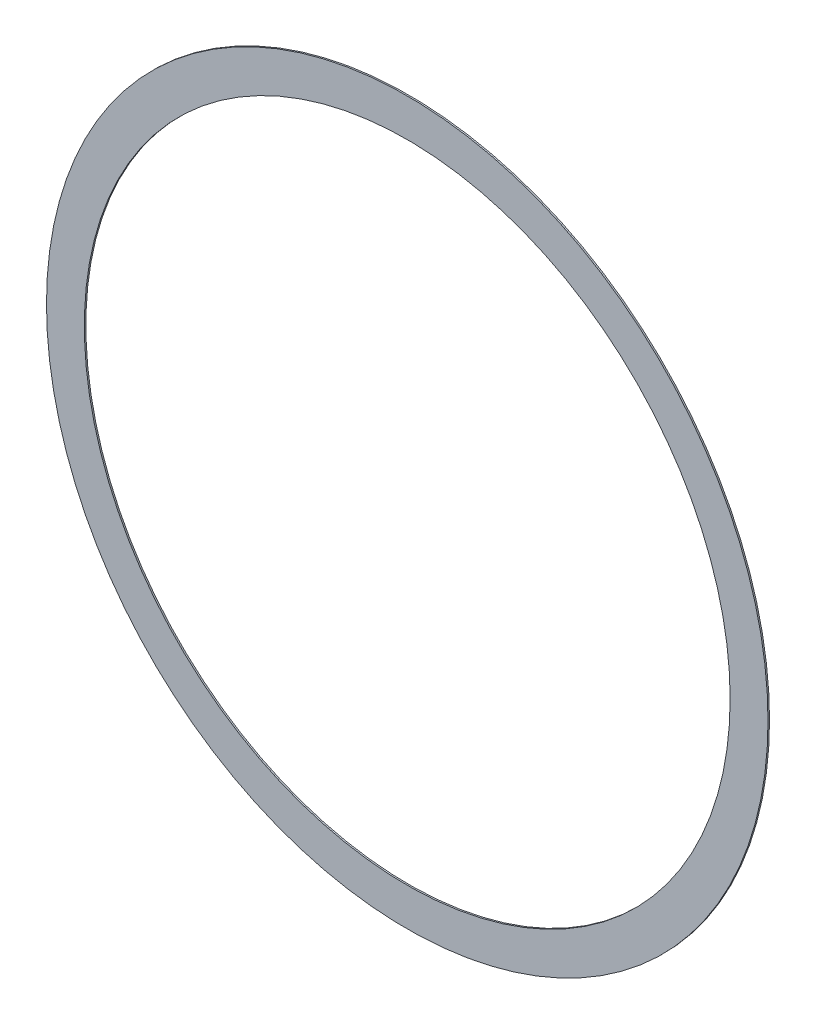
ISO-10303-21;
HEADER;
FILE_DESCRIPTION(('STEP AP214'),'2;1');
FILE_NAME('part.step','',(''),(''),'','','');
FILE_SCHEMA(('AUTOMOTIVE_DESIGN { 1 0 10303 214 1 1 1 1 }'));
ENDSEC;
DATA;
#1=APPLICATION_CONTEXT('core data for automotive mechanical design processes');
#2=APPLICATION_PROTOCOL_DEFINITION('international standard','automotive_design',2000,#1);
#3=PRODUCT_CONTEXT('',#1,'mechanical');
#4=PRODUCT('Part','Part','',(#3));
#5=PRODUCT_RELATED_PRODUCT_CATEGORY('part','',(#4));
#6=PRODUCT_DEFINITION_FORMATION('','',#4);
#7=PRODUCT_DEFINITION_CONTEXT('part definition',#1,'design');
#8=PRODUCT_DEFINITION('design','',#6,#7);
#9=PRODUCT_DEFINITION_SHAPE('','',#8);
#10=(LENGTH_UNIT() NAMED_UNIT(*) SI_UNIT(.MILLI.,.METRE.));
#11=(NAMED_UNIT(*) PLANE_ANGLE_UNIT() SI_UNIT($,.RADIAN.));
#12=(NAMED_UNIT(*) SI_UNIT($,.STERADIAN.) SOLID_ANGLE_UNIT());
#13=UNCERTAINTY_MEASURE_WITH_UNIT(LENGTH_MEASURE(1.E-05),#10,'distance_accuracy_value','');
#14=(GEOMETRIC_REPRESENTATION_CONTEXT(3) GLOBAL_UNCERTAINTY_ASSIGNED_CONTEXT((#13)) GLOBAL_UNIT_ASSIGNED_CONTEXT((#10,
#11,#12)) REPRESENTATION_CONTEXT('',''));
#15=CARTESIAN_POINT('',(0.,0.,0.));
#16=DIRECTION('',(0.,0.,1.));
#17=DIRECTION('',(1.,0.,0.));
#18=AXIS2_PLACEMENT_3D('',#15,#16,#17);
#19=CARTESIAN_POINT('',(0.,0.,2.));
#20=DIRECTION('',(0.,0.,1.));
#21=DIRECTION('',(1.,0.,0.));
#22=AXIS2_PLACEMENT_3D('',#19,#20,#21);
#23=PLANE('',#22);
#24=CARTESIAN_POINT('',(0.,0.,2.));
#25=DIRECTION('',(0.,0.,1.));
#26=DIRECTION('',(1.,0.,0.));
#27=AXIS2_PLACEMENT_3D('',#24,#25,#26);
#28=CIRCLE('',#27,476.5);
#29=CARTESIAN_POINT('',(476.5,0.,2.));
#30=VERTEX_POINT('',#29);
#31=EDGE_CURVE('E10',#30,#30,#28,.T.);
#32=ORIENTED_EDGE('',*,*,#31,.T.);
#33=EDGE_LOOP('',(#32));
#34=FACE_BOUND('',#33,.T.);
#35=CARTESIAN_POINT('',(0.,0.,2.));
#36=DIRECTION('',(0.,0.,1.));
#37=DIRECTION('',(1.,0.,0.));
#38=AXIS2_PLACEMENT_3D('',#35,#36,#37);
#39=CIRCLE('',#38,426.5);
#40=CARTESIAN_POINT('',(426.5,0.,2.));
#41=VERTEX_POINT('',#40);
#42=EDGE_CURVE('E41',#41,#41,#39,.T.);
#43=ORIENTED_EDGE('',*,*,#42,.F.);
#44=EDGE_LOOP('',(#43));
#45=FACE_BOUND('',#44,.T.);
#46=ADVANCED_FACE('F30',(#34,#45),#23,.T.);
#47=CARTESIAN_POINT('',(0.,0.,0.));
#48=DIRECTION('',(0.,0.,1.));
#49=DIRECTION('',(1.,0.,0.));
#50=AXIS2_PLACEMENT_3D('',#47,#48,#49);
#51=PLANE('',#50);
#52=CARTESIAN_POINT('',(0.,0.,0.));
#53=DIRECTION('',(0.,0.,1.));
#54=DIRECTION('',(1.,0.,0.));
#55=AXIS2_PLACEMENT_3D('',#52,#53,#54);
#56=CIRCLE('',#55,476.5);
#57=CARTESIAN_POINT('',(476.5,0.,0.));
#58=VERTEX_POINT('',#57);
#59=EDGE_CURVE('E34',#58,#58,#56,.T.);
#60=ORIENTED_EDGE('',*,*,#59,.F.);
#61=EDGE_LOOP('',(#60));
#62=FACE_BOUND('',#61,.T.);
#63=CARTESIAN_POINT('',(0.,0.,0.));
#64=DIRECTION('',(0.,0.,1.));
#65=DIRECTION('',(1.,0.,0.));
#66=AXIS2_PLACEMENT_3D('',#63,#64,#65);
#67=CIRCLE('',#66,426.5);
#68=CARTESIAN_POINT('',(426.5,0.,0.));
#69=VERTEX_POINT('',#68);
#70=EDGE_CURVE('E43',#69,#69,#67,.T.);
#71=ORIENTED_EDGE('',*,*,#70,.T.);
#72=EDGE_LOOP('',(#71));
#73=FACE_BOUND('',#72,.T.);
#74=ADVANCED_FACE('F53',(#62,#73),#51,.F.);
#75=CARTESIAN_POINT('',(0.,0.,2.));
#76=DIRECTION('',(0.,0.,-1.));
#77=DIRECTION('',(-1.,0.,0.));
#78=AXIS2_PLACEMENT_3D('',#75,#76,#77);
#79=CYLINDRICAL_SURFACE('',#78,476.5);
#80=ORIENTED_EDGE('',*,*,#31,.F.);
#81=EDGE_LOOP('',(#80));
#82=FACE_BOUND('',#81,.T.);
#83=ORIENTED_EDGE('',*,*,#59,.T.);
#84=EDGE_LOOP('',(#83));
#85=FACE_BOUND('',#84,.T.);
#86=ADVANCED_FACE('F32',(#82,#85),#79,.T.);
#87=CARTESIAN_POINT('',(0.,0.,2.));
#88=DIRECTION('',(0.,0.,-1.));
#89=DIRECTION('',(-1.,0.,0.));
#90=AXIS2_PLACEMENT_3D('',#87,#88,#89);
#91=CYLINDRICAL_SURFACE('',#90,426.5);
#92=ORIENTED_EDGE('',*,*,#42,.T.);
#93=EDGE_LOOP('',(#92));
#94=FACE_BOUND('',#93,.T.);
#95=ORIENTED_EDGE('',*,*,#70,.F.);
#96=EDGE_LOOP('',(#95));
#97=FACE_BOUND('',#96,.T.);
#98=ADVANCED_FACE('F49',(#94,#97),#91,.F.);
#99=CLOSED_SHELL('',(#46,#74,#86,#98));
#100=MANIFOLD_SOLID_BREP('B2',#99);
#101=ADVANCED_BREP_SHAPE_REPRESENTATION('',(#18,#100),#14);
#102=SHAPE_DEFINITION_REPRESENTATION(#9,#101);
ENDSEC;
END-ISO-10303-21;
